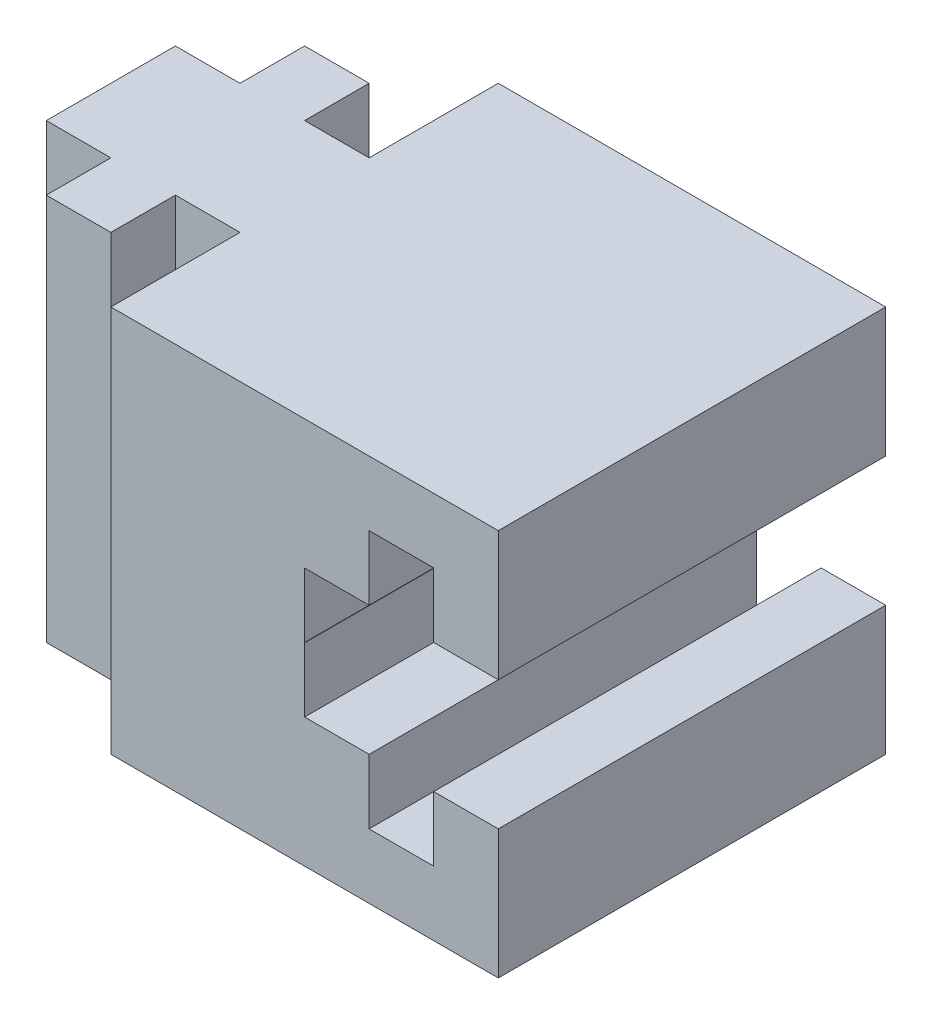
ISO-10303-21;
HEADER;
FILE_DESCRIPTION(('STEP AP214'),'2;1');
FILE_NAME('part.step','',(''),(''),'','','');
FILE_SCHEMA(('AUTOMOTIVE_DESIGN { 1 0 10303 214 1 1 1 1 }'));
ENDSEC;
DATA;
#1=APPLICATION_CONTEXT('core data for automotive mechanical design processes');
#2=APPLICATION_PROTOCOL_DEFINITION('international standard','automotive_design',2000,#1);
#3=PRODUCT_CONTEXT('',#1,'mechanical');
#4=PRODUCT('Part','Part','',(#3));
#5=PRODUCT_RELATED_PRODUCT_CATEGORY('part','',(#4));
#6=PRODUCT_DEFINITION_FORMATION('','',#4);
#7=PRODUCT_DEFINITION_CONTEXT('part definition',#1,'design');
#8=PRODUCT_DEFINITION('design','',#6,#7);
#9=PRODUCT_DEFINITION_SHAPE('','',#8);
#10=(LENGTH_UNIT() NAMED_UNIT(*) SI_UNIT(.MILLI.,.METRE.));
#11=(NAMED_UNIT(*) PLANE_ANGLE_UNIT() SI_UNIT($,.RADIAN.));
#12=(NAMED_UNIT(*) SI_UNIT($,.STERADIAN.) SOLID_ANGLE_UNIT());
#13=UNCERTAINTY_MEASURE_WITH_UNIT(LENGTH_MEASURE(1.E-05),#10,'distance_accuracy_value','');
#14=(GEOMETRIC_REPRESENTATION_CONTEXT(3) GLOBAL_UNCERTAINTY_ASSIGNED_CONTEXT((#13)) GLOBAL_UNIT_ASSIGNED_CONTEXT((#10,
#11,#12)) REPRESENTATION_CONTEXT('',''));
#15=CARTESIAN_POINT('',(0.,0.,0.));
#16=DIRECTION('',(0.,0.,1.));
#17=DIRECTION('',(1.,0.,0.));
#18=AXIS2_PLACEMENT_3D('',#15,#16,#17);
#19=CARTESIAN_POINT('',(225.,0.,0.));
#20=DIRECTION('',(1.,0.,0.));
#21=DIRECTION('',(0.,0.,-1.));
#22=AXIS2_PLACEMENT_3D('',#19,#20,#21);
#23=PLANE('',#22);
#24=DIRECTION('',(0.,0.,1.));
#25=VECTOR('',#24,1.);
#26=CARTESIAN_POINT('',(225.,-25.,-75.));
#27=LINE('',#26,#25);
#28=CARTESIAN_POINT('',(225.,-25.,-75.));
#29=VERTEX_POINT('',#28);
#30=CARTESIAN_POINT('',(225.,-25.,75.));
#31=VERTEX_POINT('',#30);
#32=EDGE_CURVE('E244',#29,#31,#27,.T.);
#33=ORIENTED_EDGE('',*,*,#32,.T.);
#34=DIRECTION('',(0.,-1.,0.));
#35=VECTOR('',#34,1.);
#36=CARTESIAN_POINT('',(225.,75.,75.));
#37=LINE('',#36,#35);
#38=CARTESIAN_POINT('',(225.,-75.,75.));
#39=VERTEX_POINT('',#38);
#40=EDGE_CURVE('E271',#31,#39,#37,.T.);
#41=ORIENTED_EDGE('',*,*,#40,.T.);
#42=DIRECTION('',(0.,0.,-1.));
#43=VECTOR('',#42,1.);
#44=CARTESIAN_POINT('',(225.,-75.,75.));
#45=LINE('',#44,#43);
#46=CARTESIAN_POINT('',(225.,-75.,-75.));
#47=VERTEX_POINT('',#46);
#48=EDGE_CURVE('E266',#39,#47,#45,.T.);
#49=ORIENTED_EDGE('',*,*,#48,.T.);
#50=DIRECTION('',(0.,1.,0.));
#51=VECTOR('',#50,1.);
#52=CARTESIAN_POINT('',(225.,75.,-75.));
#53=LINE('',#52,#51);
#54=EDGE_CURVE('E260',#47,#29,#53,.T.);
#55=ORIENTED_EDGE('',*,*,#54,.T.);
#56=EDGE_LOOP('',(#33,#41,#49,#55));
#57=FACE_BOUND('',#56,.T.);
#58=ADVANCED_FACE('F35',(#57),#23,.T.);
#59=CARTESIAN_POINT('',(225.,75.,-75.));
#60=DIRECTION('',(0.,0.,1.));
#61=DIRECTION('',(1.,0.,0.));
#62=AXIS2_PLACEMENT_3D('',#59,#60,#61);
#63=PLANE('',#62);
#64=DIRECTION('',(0.,1.,0.));
#65=VECTOR('',#64,1.);
#66=CARTESIAN_POINT('',(200.,-50.,-75.));
#67=LINE('',#66,#65);
#68=CARTESIAN_POINT('',(200.,-50.,-75.));
#69=VERTEX_POINT('',#68);
#70=CARTESIAN_POINT('',(200.,-25.,-75.));
#71=VERTEX_POINT('',#70);
#72=EDGE_CURVE('E255',#69,#71,#67,.T.);
#73=ORIENTED_EDGE('',*,*,#72,.T.);
#74=DIRECTION('',(1.,0.,0.));
#75=VECTOR('',#74,1.);
#76=CARTESIAN_POINT('',(200.,-25.,-75.));
#77=LINE('',#76,#75);
#78=EDGE_CURVE('E247',#71,#29,#77,.T.);
#79=ORIENTED_EDGE('',*,*,#78,.T.);
#80=ORIENTED_EDGE('',*,*,#54,.F.);
#81=DIRECTION('',(-1.,0.,0.));
#82=VECTOR('',#81,1.);
#83=CARTESIAN_POINT('',(225.,-75.,-75.));
#84=LINE('',#83,#82);
#85=CARTESIAN_POINT('',(75.,-75.,-75.));
#86=VERTEX_POINT('',#85);
#87=EDGE_CURVE('E282',#47,#86,#84,.T.);
#88=ORIENTED_EDGE('',*,*,#87,.T.);
#89=DIRECTION('',(0.,1.,0.));
#90=VECTOR('',#89,1.);
#91=CARTESIAN_POINT('',(75.,-75.,-75.));
#92=LINE('',#91,#90);
#93=CARTESIAN_POINT('',(75.,75.,-75.));
#94=VERTEX_POINT('',#93);
#95=EDGE_CURVE('E367',#86,#94,#92,.T.);
#96=ORIENTED_EDGE('',*,*,#95,.T.);
#97=DIRECTION('',(-1.,0.,0.));
#98=VECTOR('',#97,1.);
#99=CARTESIAN_POINT('',(225.,75.,-75.));
#100=LINE('',#99,#98);
#101=CARTESIAN_POINT('',(225.,75.,-75.));
#102=VERTEX_POINT('',#101);
#103=EDGE_CURVE('E11',#102,#94,#100,.T.);
#104=ORIENTED_EDGE('',*,*,#103,.F.);
#105=CARTESIAN_POINT('',(225.,25.,-75.));
#106=VERTEX_POINT('',#105);
#107=EDGE_CURVE('E269',#106,#102,#53,.T.);
#108=ORIENTED_EDGE('',*,*,#107,.F.);
#109=DIRECTION('',(-1.,0.,0.));
#110=VECTOR('',#109,1.);
#111=CARTESIAN_POINT('',(225.,25.,-75.));
#112=LINE('',#111,#110);
#113=CARTESIAN_POINT('',(200.,25.,-75.));
#114=VERTEX_POINT('',#113);
#115=EDGE_CURVE('E50',#106,#114,#112,.T.);
#116=ORIENTED_EDGE('',*,*,#115,.T.);
#117=DIRECTION('',(0.,1.,0.));
#118=VECTOR('',#117,1.);
#119=CARTESIAN_POINT('',(200.,25.,-75.));
#120=LINE('',#119,#118);
#121=CARTESIAN_POINT('',(200.,50.,-75.));
#122=VERTEX_POINT('',#121);
#123=EDGE_CURVE('E513',#114,#122,#120,.T.);
#124=ORIENTED_EDGE('',*,*,#123,.T.);
#125=DIRECTION('',(-1.,0.,0.));
#126=VECTOR('',#125,1.);
#127=CARTESIAN_POINT('',(200.,50.,-75.));
#128=LINE('',#127,#126);
#129=CARTESIAN_POINT('',(175.,50.,-75.));
#130=VERTEX_POINT('',#129);
#131=EDGE_CURVE('E510',#122,#130,#128,.T.);
#132=ORIENTED_EDGE('',*,*,#131,.T.);
#133=DIRECTION('',(0.,-1.,0.));
#134=VECTOR('',#133,1.);
#135=CARTESIAN_POINT('',(175.,50.,-75.));
#136=LINE('',#135,#134);
#137=CARTESIAN_POINT('',(175.,25.,-75.));
#138=VERTEX_POINT('',#137);
#139=EDGE_CURVE('E507',#130,#138,#136,.T.);
#140=ORIENTED_EDGE('',*,*,#139,.T.);
#141=DIRECTION('',(-1.,0.,0.));
#142=VECTOR('',#141,1.);
#143=CARTESIAN_POINT('',(175.,25.,-75.));
#144=LINE('',#143,#142);
#145=CARTESIAN_POINT('',(150.,25.,-75.));
#146=VERTEX_POINT('',#145);
#147=EDGE_CURVE('E504',#138,#146,#144,.T.);
#148=ORIENTED_EDGE('',*,*,#147,.T.);
#149=DIRECTION('',(0.,-1.,0.));
#150=VECTOR('',#149,1.);
#151=CARTESIAN_POINT('',(150.,25.,-75.));
#152=LINE('',#151,#150);
#153=CARTESIAN_POINT('',(150.,0.,-75.));
#154=VERTEX_POINT('',#153);
#155=EDGE_CURVE('E501',#146,#154,#152,.T.);
#156=ORIENTED_EDGE('',*,*,#155,.T.);
#157=DIRECTION('',(-1.,0.,0.));
#158=VECTOR('',#157,1.);
#159=CARTESIAN_POINT('',(150.,0.,-75.));
#160=LINE('',#159,#158);
#161=CARTESIAN_POINT('',(149.85679380495,0.,-75.));
#162=VERTEX_POINT('',#161);
#163=EDGE_CURVE('E498',#154,#162,#160,.T.);
#164=ORIENTED_EDGE('',*,*,#163,.T.);
#165=DIRECTION('',(0.,-1.,0.));
#166=VECTOR('',#165,1.);
#167=CARTESIAN_POINT('',(149.85679380495,0.,-75.));
#168=LINE('',#167,#166);
#169=CARTESIAN_POINT('',(149.85679380495,-0.127059700129785,-75.));
#170=VERTEX_POINT('',#169);
#171=EDGE_CURVE('E495',#162,#170,#168,.T.);
#172=ORIENTED_EDGE('',*,*,#171,.T.);
#173=DIRECTION('',(-1.,0.,0.));
#174=VECTOR('',#173,1.);
#175=CARTESIAN_POINT('',(150.,-0.127059700129785,-75.));
#176=LINE('',#175,#174);
#177=CARTESIAN_POINT('',(150.,-0.127059700129785,-75.));
#178=VERTEX_POINT('',#177);
#179=EDGE_CURVE('E493',#178,#170,#176,.T.);
#180=ORIENTED_EDGE('',*,*,#179,.F.);
#181=DIRECTION('',(0.,-1.,0.));
#182=VECTOR('',#181,1.);
#183=CARTESIAN_POINT('',(150.,-0.127059700129785,-75.));
#184=LINE('',#183,#182);
#185=CARTESIAN_POINT('',(150.,-25.,-75.));
#186=VERTEX_POINT('',#185);
#187=EDGE_CURVE('E490',#178,#186,#184,.T.);
#188=ORIENTED_EDGE('',*,*,#187,.T.);
#189=DIRECTION('',(1.,0.,0.));
#190=VECTOR('',#189,1.);
#191=CARTESIAN_POINT('',(150.,-25.,-75.));
#192=LINE('',#191,#190);
#193=CARTESIAN_POINT('',(175.,-25.,-75.));
#194=VERTEX_POINT('',#193);
#195=EDGE_CURVE('E487',#186,#194,#192,.T.);
#196=ORIENTED_EDGE('',*,*,#195,.T.);
#197=DIRECTION('',(0.,-1.,0.));
#198=VECTOR('',#197,1.);
#199=CARTESIAN_POINT('',(175.,-25.,-75.));
#200=LINE('',#199,#198);
#201=CARTESIAN_POINT('',(175.,-50.,-75.));
#202=VERTEX_POINT('',#201);
#203=EDGE_CURVE('E484',#194,#202,#200,.T.);
#204=ORIENTED_EDGE('',*,*,#203,.T.);
#205=DIRECTION('',(1.,0.,0.));
#206=VECTOR('',#205,1.);
#207=CARTESIAN_POINT('',(175.,-50.,-75.));
#208=LINE('',#207,#206);
#209=EDGE_CURVE('E482',#202,#69,#208,.T.);
#210=ORIENTED_EDGE('',*,*,#209,.T.);
#211=EDGE_LOOP('',(#73,#79,#80,#88,#96,#104,#108,#116,#124,#132,#140,#148,#156,#164,#172,#180,
#188,#196,#204,#210));
#212=FACE_BOUND('',#211,.T.);
#213=ADVANCED_FACE('F37',(#212),#63,.F.);
#214=CARTESIAN_POINT('',(225.,75.,75.));
#215=DIRECTION('',(0.,-1.,0.));
#216=DIRECTION('',(0.,0.,-1.));
#217=AXIS2_PLACEMENT_3D('',#214,#215,#216);
#218=PLANE('',#217);
#219=DIRECTION('',(0.,0.,-1.));
#220=VECTOR('',#219,1.);
#221=CARTESIAN_POINT('',(25.,75.,0.));
#222=LINE('',#221,#220);
#223=CARTESIAN_POINT('',(25.,75.,-25.));
#224=VERTEX_POINT('',#223);
#225=CARTESIAN_POINT('',(25.,75.,-50.));
#226=VERTEX_POINT('',#225);
#227=EDGE_CURVE('E387',#224,#226,#222,.T.);
#228=ORIENTED_EDGE('',*,*,#227,.F.);
#229=DIRECTION('',(1.,0.,0.));
#230=VECTOR('',#229,1.);
#231=CARTESIAN_POINT('',(0.,75.,-25.));
#232=LINE('',#231,#230);
#233=CARTESIAN_POINT('',(0.,75.,-25.));
#234=VERTEX_POINT('',#233);
#235=EDGE_CURVE('E390',#234,#224,#232,.T.);
#236=ORIENTED_EDGE('',*,*,#235,.F.);
#237=DIRECTION('',(0.,0.,1.));
#238=VECTOR('',#237,1.);
#239=CARTESIAN_POINT('',(0.,75.,75.));
#240=LINE('',#239,#238);
#241=CARTESIAN_POINT('',(0.,75.,25.));
#242=VERTEX_POINT('',#241);
#243=EDGE_CURVE('E283',#234,#242,#240,.T.);
#244=ORIENTED_EDGE('',*,*,#243,.T.);
#245=DIRECTION('',(-1.,0.,0.));
#246=VECTOR('',#245,1.);
#247=CARTESIAN_POINT('',(0.,75.,25.));
#248=LINE('',#247,#246);
#249=CARTESIAN_POINT('',(25.,75.,25.));
#250=VERTEX_POINT('',#249);
#251=EDGE_CURVE('E58',#250,#242,#248,.T.);
#252=ORIENTED_EDGE('',*,*,#251,.F.);
#253=DIRECTION('',(0.,0.,-1.));
#254=VECTOR('',#253,1.);
#255=CARTESIAN_POINT('',(25.,75.,0.));
#256=LINE('',#255,#254);
#257=CARTESIAN_POINT('',(25.,75.,50.));
#258=VERTEX_POINT('',#257);
#259=EDGE_CURVE('E328',#258,#250,#256,.T.);
#260=ORIENTED_EDGE('',*,*,#259,.F.);
#261=DIRECTION('',(1.,0.,0.));
#262=VECTOR('',#261,1.);
#263=CARTESIAN_POINT('',(0.,75.,50.));
#264=LINE('',#263,#262);
#265=CARTESIAN_POINT('',(50.,75.,50.));
#266=VERTEX_POINT('',#265);
#267=EDGE_CURVE('E325',#258,#266,#264,.T.);
#268=ORIENTED_EDGE('',*,*,#267,.T.);
#269=DIRECTION('',(0.,0.,1.));
#270=VECTOR('',#269,1.);
#271=CARTESIAN_POINT('',(50.,75.,0.));
#272=LINE('',#271,#270);
#273=CARTESIAN_POINT('',(50.,75.,25.));
#274=VERTEX_POINT('',#273);
#275=EDGE_CURVE('E315',#274,#266,#272,.T.);
#276=ORIENTED_EDGE('',*,*,#275,.F.);
#277=DIRECTION('',(-1.,0.,0.));
#278=VECTOR('',#277,1.);
#279=CARTESIAN_POINT('',(0.,75.,25.));
#280=LINE('',#279,#278);
#281=CARTESIAN_POINT('',(75.,75.,25.));
#282=VERTEX_POINT('',#281);
#283=EDGE_CURVE('E311',#282,#274,#280,.T.);
#284=ORIENTED_EDGE('',*,*,#283,.F.);
#285=DIRECTION('',(0.,0.,-1.));
#286=VECTOR('',#285,1.);
#287=CARTESIAN_POINT('',(75.,75.,0.));
#288=LINE('',#287,#286);
#289=CARTESIAN_POINT('',(75.,75.,75.));
#290=VERTEX_POINT('',#289);
#291=EDGE_CURVE('E308',#290,#282,#288,.T.);
#292=ORIENTED_EDGE('',*,*,#291,.F.);
#293=DIRECTION('',(-1.,0.,0.));
#294=VECTOR('',#293,1.);
#295=CARTESIAN_POINT('',(225.,75.,75.));
#296=LINE('',#295,#294);
#297=CARTESIAN_POINT('',(225.,75.,75.));
#298=VERTEX_POINT('',#297);
#299=EDGE_CURVE('E43',#298,#290,#296,.T.);
#300=ORIENTED_EDGE('',*,*,#299,.F.);
#301=DIRECTION('',(0.,0.,1.));
#302=VECTOR('',#301,1.);
#303=CARTESIAN_POINT('',(225.,75.,75.));
#304=LINE('',#303,#302);
#305=EDGE_CURVE('E268',#102,#298,#304,.T.);
#306=ORIENTED_EDGE('',*,*,#305,.F.);
#307=ORIENTED_EDGE('',*,*,#103,.T.);
#308=DIRECTION('',(0.,0.,-1.));
#309=VECTOR('',#308,1.);
#310=CARTESIAN_POINT('',(75.,75.,0.));
#311=LINE('',#310,#309);
#312=CARTESIAN_POINT('',(75.,75.,-25.));
#313=VERTEX_POINT('',#312);
#314=EDGE_CURVE('E393',#313,#94,#311,.T.);
#315=ORIENTED_EDGE('',*,*,#314,.F.);
#316=DIRECTION('',(1.,0.,0.));
#317=VECTOR('',#316,1.);
#318=CARTESIAN_POINT('',(0.,75.,-25.));
#319=LINE('',#318,#317);
#320=CARTESIAN_POINT('',(50.,75.,-25.));
#321=VERTEX_POINT('',#320);
#322=EDGE_CURVE('E335',#321,#313,#319,.T.);
#323=ORIENTED_EDGE('',*,*,#322,.F.);
#324=DIRECTION('',(0.,0.,1.));
#325=VECTOR('',#324,1.);
#326=CARTESIAN_POINT('',(50.,75.,0.));
#327=LINE('',#326,#325);
#328=CARTESIAN_POINT('',(50.,75.,-50.));
#329=VERTEX_POINT('',#328);
#330=EDGE_CURVE('E380',#329,#321,#327,.T.);
#331=ORIENTED_EDGE('',*,*,#330,.F.);
#332=DIRECTION('',(1.,0.,0.));
#333=VECTOR('',#332,1.);
#334=CARTESIAN_POINT('',(0.,75.,-50.));
#335=LINE('',#334,#333);
#336=EDGE_CURVE('E384',#226,#329,#335,.T.);
#337=ORIENTED_EDGE('',*,*,#336,.F.);
#338=EDGE_LOOP('',(#228,#236,#244,#252,#260,#268,#276,#284,#292,#300,#306,#307,#315,#323,#331,#337));
#339=FACE_BOUND('',#338,.T.);
#340=ADVANCED_FACE('F304',(#339),#218,.F.);
#341=CARTESIAN_POINT('',(225.,75.,75.));
#342=DIRECTION('',(0.,0.,-1.));
#343=DIRECTION('',(0.,1.,0.));
#344=AXIS2_PLACEMENT_3D('',#341,#342,#343);
#345=PLANE('',#344);
#346=ORIENTED_EDGE('',*,*,#40,.F.);
#347=DIRECTION('',(1.,0.,0.));
#348=VECTOR('',#347,1.);
#349=CARTESIAN_POINT('',(200.,-25.,75.));
#350=LINE('',#349,#348);
#351=CARTESIAN_POINT('',(200.,-25.,75.));
#352=VERTEX_POINT('',#351);
#353=EDGE_CURVE('E250',#352,#31,#350,.T.);
#354=ORIENTED_EDGE('',*,*,#353,.F.);
#355=DIRECTION('',(0.,1.,0.));
#356=VECTOR('',#355,1.);
#357=CARTESIAN_POINT('',(200.,-50.,75.));
#358=LINE('',#357,#356);
#359=CARTESIAN_POINT('',(200.,-50.,75.));
#360=VERTEX_POINT('',#359);
#361=EDGE_CURVE('E263',#360,#352,#358,.T.);
#362=ORIENTED_EDGE('',*,*,#361,.F.);
#363=DIRECTION('',(1.,0.,0.));
#364=VECTOR('',#363,1.);
#365=CARTESIAN_POINT('',(175.,-50.,75.));
#366=LINE('',#365,#364);
#367=CARTESIAN_POINT('',(175.,-50.,75.));
#368=VERTEX_POINT('',#367);
#369=EDGE_CURVE('E441',#368,#360,#366,.T.);
#370=ORIENTED_EDGE('',*,*,#369,.F.);
#371=DIRECTION('',(0.,-1.,0.));
#372=VECTOR('',#371,1.);
#373=CARTESIAN_POINT('',(175.,-25.,75.));
#374=LINE('',#373,#372);
#375=CARTESIAN_POINT('',(175.,-25.,75.));
#376=VERTEX_POINT('',#375);
#377=EDGE_CURVE('E444',#376,#368,#374,.T.);
#378=ORIENTED_EDGE('',*,*,#377,.F.);
#379=DIRECTION('',(1.,0.,0.));
#380=VECTOR('',#379,1.);
#381=CARTESIAN_POINT('',(150.,-25.,75.));
#382=LINE('',#381,#380);
#383=CARTESIAN_POINT('',(150.,-25.,75.));
#384=VERTEX_POINT('',#383);
#385=EDGE_CURVE('E447',#384,#376,#382,.T.);
#386=ORIENTED_EDGE('',*,*,#385,.F.);
#387=DIRECTION('',(0.,-1.,0.));
#388=VECTOR('',#387,1.);
#389=CARTESIAN_POINT('',(150.,-0.127059700129785,75.));
#390=LINE('',#389,#388);
#391=CARTESIAN_POINT('',(150.,-0.127059700129785,75.));
#392=VERTEX_POINT('',#391);
#393=EDGE_CURVE('E450',#392,#384,#390,.T.);
#394=ORIENTED_EDGE('',*,*,#393,.F.);
#395=DIRECTION('',(-1.,0.,0.));
#396=VECTOR('',#395,1.);
#397=CARTESIAN_POINT('',(150.,-0.127059700129785,75.));
#398=LINE('',#397,#396);
#399=CARTESIAN_POINT('',(149.85679380495,-0.127059700129785,75.));
#400=VERTEX_POINT('',#399);
#401=EDGE_CURVE('E453',#392,#400,#398,.T.);
#402=ORIENTED_EDGE('',*,*,#401,.T.);
#403=DIRECTION('',(0.,-1.,0.));
#404=VECTOR('',#403,1.);
#405=CARTESIAN_POINT('',(149.85679380495,0.,75.));
#406=LINE('',#405,#404);
#407=CARTESIAN_POINT('',(149.85679380495,0.,75.));
#408=VERTEX_POINT('',#407);
#409=EDGE_CURVE('E456',#408,#400,#406,.T.);
#410=ORIENTED_EDGE('',*,*,#409,.F.);
#411=DIRECTION('',(-1.,0.,0.));
#412=VECTOR('',#411,1.);
#413=CARTESIAN_POINT('',(150.,0.,75.));
#414=LINE('',#413,#412);
#415=CARTESIAN_POINT('',(150.,0.,75.));
#416=VERTEX_POINT('',#415);
#417=EDGE_CURVE('E459',#416,#408,#414,.T.);
#418=ORIENTED_EDGE('',*,*,#417,.F.);
#419=DIRECTION('',(0.,-1.,0.));
#420=VECTOR('',#419,1.);
#421=CARTESIAN_POINT('',(150.,25.,75.));
#422=LINE('',#421,#420);
#423=CARTESIAN_POINT('',(150.,25.,75.));
#424=VERTEX_POINT('',#423);
#425=EDGE_CURVE('E462',#424,#416,#422,.T.);
#426=ORIENTED_EDGE('',*,*,#425,.F.);
#427=DIRECTION('',(-1.,0.,0.));
#428=VECTOR('',#427,1.);
#429=CARTESIAN_POINT('',(175.,25.,75.));
#430=LINE('',#429,#428);
#431=CARTESIAN_POINT('',(175.,25.,75.));
#432=VERTEX_POINT('',#431);
#433=EDGE_CURVE('E465',#432,#424,#430,.T.);
#434=ORIENTED_EDGE('',*,*,#433,.F.);
#435=DIRECTION('',(0.,-1.,0.));
#436=VECTOR('',#435,1.);
#437=CARTESIAN_POINT('',(175.,50.,75.));
#438=LINE('',#437,#436);
#439=CARTESIAN_POINT('',(175.,50.,75.));
#440=VERTEX_POINT('',#439);
#441=EDGE_CURVE('E468',#440,#432,#438,.T.);
#442=ORIENTED_EDGE('',*,*,#441,.F.);
#443=DIRECTION('',(-1.,0.,0.));
#444=VECTOR('',#443,1.);
#445=CARTESIAN_POINT('',(200.,50.,75.));
#446=LINE('',#445,#444);
#447=CARTESIAN_POINT('',(200.,50.,75.));
#448=VERTEX_POINT('',#447);
#449=EDGE_CURVE('E471',#448,#440,#446,.T.);
#450=ORIENTED_EDGE('',*,*,#449,.F.);
#451=DIRECTION('',(0.,1.,0.));
#452=VECTOR('',#451,1.);
#453=CARTESIAN_POINT('',(200.,25.,75.));
#454=LINE('',#453,#452);
#455=CARTESIAN_POINT('',(200.,25.,75.));
#456=VERTEX_POINT('',#455);
#457=EDGE_CURVE('E474',#456,#448,#454,.T.);
#458=ORIENTED_EDGE('',*,*,#457,.F.);
#459=DIRECTION('',(-1.,0.,0.));
#460=VECTOR('',#459,1.);
#461=CARTESIAN_POINT('',(225.,25.,75.));
#462=LINE('',#461,#460);
#463=CARTESIAN_POINT('',(225.,25.,75.));
#464=VERTEX_POINT('',#463);
#465=EDGE_CURVE('E477',#464,#456,#462,.T.);
#466=ORIENTED_EDGE('',*,*,#465,.F.);
#467=EDGE_CURVE('E278',#298,#464,#37,.T.);
#468=ORIENTED_EDGE('',*,*,#467,.F.);
#469=ORIENTED_EDGE('',*,*,#299,.T.);
#470=DIRECTION('',(0.,1.,0.));
#471=VECTOR('',#470,1.);
#472=CARTESIAN_POINT('',(75.,-75.,75.));
#473=LINE('',#472,#471);
#474=CARTESIAN_POINT('',(75.,-75.,75.));
#475=VERTEX_POINT('',#474);
#476=EDGE_CURVE('E275',#475,#290,#473,.T.);
#477=ORIENTED_EDGE('',*,*,#476,.F.);
#478=DIRECTION('',(-1.,0.,0.));
#479=VECTOR('',#478,1.);
#480=CARTESIAN_POINT('',(225.,-75.,75.));
#481=LINE('',#480,#479);
#482=EDGE_CURVE('E290',#39,#475,#481,.T.);
#483=ORIENTED_EDGE('',*,*,#482,.F.);
#484=EDGE_LOOP('',(#346,#354,#362,#370,#378,#386,#394,#402,#410,#418,#426,#434,#442,#450,#458,
#466,#468,#469,#477,#483));
#485=FACE_BOUND('',#484,.T.);
#486=ADVANCED_FACE('F297',(#485),#345,.F.);
#487=CARTESIAN_POINT('',(225.,-75.,75.));
#488=DIRECTION('',(0.,1.,0.));
#489=DIRECTION('',(0.,0.,1.));
#490=AXIS2_PLACEMENT_3D('',#487,#488,#489);
#491=PLANE('',#490);
#492=DIRECTION('',(0.,0.,-1.));
#493=VECTOR('',#492,1.);
#494=CARTESIAN_POINT('',(0.,-75.,75.));
#495=LINE('',#494,#493);
#496=CARTESIAN_POINT('',(0.,-75.,25.));
#497=VERTEX_POINT('',#496);
#498=CARTESIAN_POINT('',(0.,-75.,-25.));
#499=VERTEX_POINT('',#498);
#500=EDGE_CURVE('E273',#497,#499,#495,.T.);
#501=ORIENTED_EDGE('',*,*,#500,.T.);
#502=DIRECTION('',(1.,0.,0.));
#503=VECTOR('',#502,1.);
#504=CARTESIAN_POINT('',(0.,-75.,-25.));
#505=LINE('',#504,#503);
#506=CARTESIAN_POINT('',(25.,-75.,-25.));
#507=VERTEX_POINT('',#506);
#508=EDGE_CURVE('E405',#499,#507,#505,.T.);
#509=ORIENTED_EDGE('',*,*,#508,.T.);
#510=DIRECTION('',(0.,0.,-1.));
#511=VECTOR('',#510,1.);
#512=CARTESIAN_POINT('',(25.,-75.,0.));
#513=LINE('',#512,#511);
#514=CARTESIAN_POINT('',(25.,-75.,-50.));
#515=VERTEX_POINT('',#514);
#516=EDGE_CURVE('E402',#507,#515,#513,.T.);
#517=ORIENTED_EDGE('',*,*,#516,.T.);
#518=DIRECTION('',(1.,0.,0.));
#519=VECTOR('',#518,1.);
#520=CARTESIAN_POINT('',(0.,-75.,-50.));
#521=LINE('',#520,#519);
#522=CARTESIAN_POINT('',(50.,-75.,-50.));
#523=VERTEX_POINT('',#522);
#524=EDGE_CURVE('E399',#515,#523,#521,.T.);
#525=ORIENTED_EDGE('',*,*,#524,.T.);
#526=DIRECTION('',(0.,0.,1.));
#527=VECTOR('',#526,1.);
#528=CARTESIAN_POINT('',(50.,-75.,0.));
#529=LINE('',#528,#527);
#530=CARTESIAN_POINT('',(50.,-75.,-25.));
#531=VERTEX_POINT('',#530);
#532=EDGE_CURVE('E368',#523,#531,#529,.T.);
#533=ORIENTED_EDGE('',*,*,#532,.T.);
#534=DIRECTION('',(1.,0.,0.));
#535=VECTOR('',#534,1.);
#536=CARTESIAN_POINT('',(0.,-75.,-25.));
#537=LINE('',#536,#535);
#538=CARTESIAN_POINT('',(75.,-75.,-25.));
#539=VERTEX_POINT('',#538);
#540=EDGE_CURVE('E383',#531,#539,#537,.T.);
#541=ORIENTED_EDGE('',*,*,#540,.T.);
#542=DIRECTION('',(0.,0.,-1.));
#543=VECTOR('',#542,1.);
#544=CARTESIAN_POINT('',(75.,-75.,0.));
#545=LINE('',#544,#543);
#546=EDGE_CURVE('E408',#539,#86,#545,.T.);
#547=ORIENTED_EDGE('',*,*,#546,.T.);
#548=ORIENTED_EDGE('',*,*,#87,.F.);
#549=ORIENTED_EDGE('',*,*,#48,.F.);
#550=ORIENTED_EDGE('',*,*,#482,.T.);
#551=DIRECTION('',(0.,0.,-1.));
#552=VECTOR('',#551,1.);
#553=CARTESIAN_POINT('',(75.,-75.,0.));
#554=LINE('',#553,#552);
#555=CARTESIAN_POINT('',(75.,-75.,25.));
#556=VERTEX_POINT('',#555);
#557=EDGE_CURVE('E332',#475,#556,#554,.T.);
#558=ORIENTED_EDGE('',*,*,#557,.T.);
#559=DIRECTION('',(-1.,0.,0.));
#560=VECTOR('',#559,1.);
#561=CARTESIAN_POINT('',(0.,-75.,25.));
#562=LINE('',#561,#560);
#563=CARTESIAN_POINT('',(50.,-75.,25.));
#564=VERTEX_POINT('',#563);
#565=EDGE_CURVE('E360',#556,#564,#562,.T.);
#566=ORIENTED_EDGE('',*,*,#565,.T.);
#567=DIRECTION('',(0.,0.,1.));
#568=VECTOR('',#567,1.);
#569=CARTESIAN_POINT('',(50.,-75.,0.));
#570=LINE('',#569,#568);
#571=CARTESIAN_POINT('',(50.,-75.,50.));
#572=VERTEX_POINT('',#571);
#573=EDGE_CURVE('E355',#564,#572,#570,.T.);
#574=ORIENTED_EDGE('',*,*,#573,.T.);
#575=DIRECTION('',(1.,0.,0.));
#576=VECTOR('',#575,1.);
#577=CARTESIAN_POINT('',(0.,-75.,50.));
#578=LINE('',#577,#576);
#579=CARTESIAN_POINT('',(25.,-75.,50.));
#580=VERTEX_POINT('',#579);
#581=EDGE_CURVE('E352',#580,#572,#578,.T.);
#582=ORIENTED_EDGE('',*,*,#581,.F.);
#583=DIRECTION('',(0.,0.,-1.));
#584=VECTOR('',#583,1.);
#585=CARTESIAN_POINT('',(25.,-75.,0.));
#586=LINE('',#585,#584);
#587=CARTESIAN_POINT('',(25.,-75.,25.));
#588=VERTEX_POINT('',#587);
#589=EDGE_CURVE('E347',#580,#588,#586,.T.);
#590=ORIENTED_EDGE('',*,*,#589,.T.);
#591=DIRECTION('',(-1.,0.,0.));
#592=VECTOR('',#591,1.);
#593=CARTESIAN_POINT('',(0.,-75.,25.));
#594=LINE('',#593,#592);
#595=EDGE_CURVE('E320',#588,#497,#594,.T.);
#596=ORIENTED_EDGE('',*,*,#595,.T.);
#597=EDGE_LOOP('',(#501,#509,#517,#525,#533,#541,#547,#548,#549,#550,#558,#566,#574,#582,#590,#596));
#598=FACE_BOUND('',#597,.T.);
#599=ADVANCED_FACE('F572',(#598),#491,.F.);
#600=DIRECTION('',(0.,0.,1.));
#601=VECTOR('',#600,1.);
#602=CARTESIAN_POINT('',(225.,25.,-75.));
#603=LINE('',#602,#601);
#604=EDGE_CURVE('E254',#106,#464,#603,.T.);
#605=ORIENTED_EDGE('',*,*,#604,.F.);
#606=ORIENTED_EDGE('',*,*,#107,.T.);
#607=ORIENTED_EDGE('',*,*,#305,.T.);
#608=ORIENTED_EDGE('',*,*,#467,.T.);
#609=EDGE_LOOP('',(#605,#606,#607,#608));
#610=FACE_BOUND('',#609,.T.);
#611=ADVANCED_FACE('F519',(#610),#23,.T.);
#612=CARTESIAN_POINT('',(0.,0.,0.));
#613=DIRECTION('',(1.,0.,0.));
#614=DIRECTION('',(0.,0.,-1.));
#615=AXIS2_PLACEMENT_3D('',#612,#613,#614);
#616=PLANE('',#615);
#617=ORIENTED_EDGE('',*,*,#243,.F.);
#618=DIRECTION('',(0.,1.,0.));
#619=VECTOR('',#618,1.);
#620=CARTESIAN_POINT('',(0.,-75.,-25.));
#621=LINE('',#620,#619);
#622=EDGE_CURVE('E371',#499,#234,#621,.T.);
#623=ORIENTED_EDGE('',*,*,#622,.F.);
#624=ORIENTED_EDGE('',*,*,#500,.F.);
#625=DIRECTION('',(0.,1.,0.));
#626=VECTOR('',#625,1.);
#627=CARTESIAN_POINT('',(0.,-75.,25.));
#628=LINE('',#627,#626);
#629=EDGE_CURVE('E333',#497,#242,#628,.T.);
#630=ORIENTED_EDGE('',*,*,#629,.T.);
#631=EDGE_LOOP('',(#617,#623,#624,#630));
#632=FACE_BOUND('',#631,.T.);
#633=ADVANCED_FACE('F598',(#632),#616,.F.);
#634=CARTESIAN_POINT('',(0.,-75.,25.));
#635=DIRECTION('',(0.,0.,-1.));
#636=DIRECTION('',(-1.,0.,0.));
#637=AXIS2_PLACEMENT_3D('',#634,#635,#636);
#638=PLANE('',#637);
#639=ORIENTED_EDGE('',*,*,#251,.T.);
#640=ORIENTED_EDGE('',*,*,#629,.F.);
#641=ORIENTED_EDGE('',*,*,#595,.F.);
#642=DIRECTION('',(0.,1.,0.));
#643=VECTOR('',#642,1.);
#644=CARTESIAN_POINT('',(25.,-75.,25.));
#645=LINE('',#644,#643);
#646=EDGE_CURVE('E336',#588,#250,#645,.T.);
#647=ORIENTED_EDGE('',*,*,#646,.T.);
#648=EDGE_LOOP('',(#639,#640,#641,#647));
#649=FACE_BOUND('',#648,.T.);
#650=ADVANCED_FACE('F599',(#649),#638,.F.);
#651=CARTESIAN_POINT('',(25.,-75.,0.));
#652=DIRECTION('',(1.,0.,0.));
#653=DIRECTION('',(0.,0.,-1.));
#654=AXIS2_PLACEMENT_3D('',#651,#652,#653);
#655=PLANE('',#654);
#656=ORIENTED_EDGE('',*,*,#259,.T.);
#657=ORIENTED_EDGE('',*,*,#646,.F.);
#658=ORIENTED_EDGE('',*,*,#589,.F.);
#659=DIRECTION('',(0.,1.,0.));
#660=VECTOR('',#659,1.);
#661=CARTESIAN_POINT('',(25.,-75.,50.));
#662=LINE('',#661,#660);
#663=EDGE_CURVE('E338',#580,#258,#662,.T.);
#664=ORIENTED_EDGE('',*,*,#663,.T.);
#665=EDGE_LOOP('',(#656,#657,#658,#664));
#666=FACE_BOUND('',#665,.T.);
#667=ADVANCED_FACE('F602',(#666),#655,.F.);
#668=CARTESIAN_POINT('',(0.,-75.,50.));
#669=DIRECTION('',(0.,0.,1.));
#670=DIRECTION('',(1.,0.,0.));
#671=AXIS2_PLACEMENT_3D('',#668,#669,#670);
#672=PLANE('',#671);
#673=ORIENTED_EDGE('',*,*,#267,.F.);
#674=ORIENTED_EDGE('',*,*,#663,.F.);
#675=ORIENTED_EDGE('',*,*,#581,.T.);
#676=DIRECTION('',(0.,1.,0.));
#677=VECTOR('',#676,1.);
#678=CARTESIAN_POINT('',(50.,-75.,50.));
#679=LINE('',#678,#677);
#680=EDGE_CURVE('E340',#572,#266,#679,.T.);
#681=ORIENTED_EDGE('',*,*,#680,.T.);
#682=EDGE_LOOP('',(#673,#674,#675,#681));
#683=FACE_BOUND('',#682,.T.);
#684=ADVANCED_FACE('F605',(#683),#672,.T.);
#685=CARTESIAN_POINT('',(50.,-75.,0.));
#686=DIRECTION('',(-1.,0.,0.));
#687=DIRECTION('',(0.,0.,1.));
#688=AXIS2_PLACEMENT_3D('',#685,#686,#687);
#689=PLANE('',#688);
#690=ORIENTED_EDGE('',*,*,#275,.T.);
#691=ORIENTED_EDGE('',*,*,#680,.F.);
#692=ORIENTED_EDGE('',*,*,#573,.F.);
#693=DIRECTION('',(0.,1.,0.));
#694=VECTOR('',#693,1.);
#695=CARTESIAN_POINT('',(50.,-75.,25.));
#696=LINE('',#695,#694);
#697=EDGE_CURVE('E342',#564,#274,#696,.T.);
#698=ORIENTED_EDGE('',*,*,#697,.T.);
#699=EDGE_LOOP('',(#690,#691,#692,#698));
#700=FACE_BOUND('',#699,.T.);
#701=ADVANCED_FACE('F609',(#700),#689,.F.);
#702=CARTESIAN_POINT('',(0.,-75.,25.));
#703=DIRECTION('',(0.,0.,-1.));
#704=DIRECTION('',(-1.,0.,0.));
#705=AXIS2_PLACEMENT_3D('',#702,#703,#704);
#706=PLANE('',#705);
#707=ORIENTED_EDGE('',*,*,#283,.T.);
#708=ORIENTED_EDGE('',*,*,#697,.F.);
#709=ORIENTED_EDGE('',*,*,#565,.F.);
#710=DIRECTION('',(0.,1.,0.));
#711=VECTOR('',#710,1.);
#712=CARTESIAN_POINT('',(75.,-75.,25.));
#713=LINE('',#712,#711);
#714=EDGE_CURVE('E343',#556,#282,#713,.T.);
#715=ORIENTED_EDGE('',*,*,#714,.T.);
#716=EDGE_LOOP('',(#707,#708,#709,#715));
#717=FACE_BOUND('',#716,.T.);
#718=ADVANCED_FACE('F610',(#717),#706,.F.);
#719=CARTESIAN_POINT('',(75.,-75.,0.));
#720=DIRECTION('',(1.,0.,0.));
#721=DIRECTION('',(0.,0.,-1.));
#722=AXIS2_PLACEMENT_3D('',#719,#720,#721);
#723=PLANE('',#722);
#724=ORIENTED_EDGE('',*,*,#291,.T.);
#725=ORIENTED_EDGE('',*,*,#714,.F.);
#726=ORIENTED_EDGE('',*,*,#557,.F.);
#727=ORIENTED_EDGE('',*,*,#476,.T.);
#728=EDGE_LOOP('',(#724,#725,#726,#727));
#729=FACE_BOUND('',#728,.T.);
#730=ADVANCED_FACE('F612',(#729),#723,.F.);
#731=CARTESIAN_POINT('',(0.,-75.,-25.));
#732=DIRECTION('',(0.,0.,1.));
#733=DIRECTION('',(1.,0.,0.));
#734=AXIS2_PLACEMENT_3D('',#731,#732,#733);
#735=PLANE('',#734);
#736=ORIENTED_EDGE('',*,*,#322,.T.);
#737=DIRECTION('',(0.,1.,0.));
#738=VECTOR('',#737,1.);
#739=CARTESIAN_POINT('',(75.,-75.,-25.));
#740=LINE('',#739,#738);
#741=EDGE_CURVE('E365',#539,#313,#740,.T.);
#742=ORIENTED_EDGE('',*,*,#741,.F.);
#743=ORIENTED_EDGE('',*,*,#540,.F.);
#744=DIRECTION('',(0.,1.,0.));
#745=VECTOR('',#744,1.);
#746=CARTESIAN_POINT('',(50.,-75.,-25.));
#747=LINE('',#746,#745);
#748=EDGE_CURVE('E286',#531,#321,#747,.T.);
#749=ORIENTED_EDGE('',*,*,#748,.T.);
#750=EDGE_LOOP('',(#736,#742,#743,#749));
#751=FACE_BOUND('',#750,.T.);
#752=ADVANCED_FACE('F581',(#751),#735,.F.);
#753=CARTESIAN_POINT('',(50.,-75.,0.));
#754=DIRECTION('',(-1.,0.,0.));
#755=DIRECTION('',(0.,0.,1.));
#756=AXIS2_PLACEMENT_3D('',#753,#754,#755);
#757=PLANE('',#756);
#758=ORIENTED_EDGE('',*,*,#330,.T.);
#759=ORIENTED_EDGE('',*,*,#748,.F.);
#760=ORIENTED_EDGE('',*,*,#532,.F.);
#761=DIRECTION('',(0.,1.,0.));
#762=VECTOR('',#761,1.);
#763=CARTESIAN_POINT('',(50.,-75.,-50.));
#764=LINE('',#763,#762);
#765=EDGE_CURVE('E377',#523,#329,#764,.T.);
#766=ORIENTED_EDGE('',*,*,#765,.T.);
#767=EDGE_LOOP('',(#758,#759,#760,#766));
#768=FACE_BOUND('',#767,.T.);
#769=ADVANCED_FACE('F584',(#768),#757,.F.);
#770=CARTESIAN_POINT('',(0.,-75.,-50.));
#771=DIRECTION('',(0.,0.,1.));
#772=DIRECTION('',(1.,0.,0.));
#773=AXIS2_PLACEMENT_3D('',#770,#771,#772);
#774=PLANE('',#773);
#775=ORIENTED_EDGE('',*,*,#336,.T.);
#776=ORIENTED_EDGE('',*,*,#765,.F.);
#777=ORIENTED_EDGE('',*,*,#524,.F.);
#778=DIRECTION('',(0.,1.,0.));
#779=VECTOR('',#778,1.);
#780=CARTESIAN_POINT('',(25.,-75.,-50.));
#781=LINE('',#780,#779);
#782=EDGE_CURVE('E375',#515,#226,#781,.T.);
#783=ORIENTED_EDGE('',*,*,#782,.T.);
#784=EDGE_LOOP('',(#775,#776,#777,#783));
#785=FACE_BOUND('',#784,.T.);
#786=ADVANCED_FACE('F588',(#785),#774,.F.);
#787=CARTESIAN_POINT('',(25.,-75.,0.));
#788=DIRECTION('',(1.,0.,0.));
#789=DIRECTION('',(0.,0.,-1.));
#790=AXIS2_PLACEMENT_3D('',#787,#788,#789);
#791=PLANE('',#790);
#792=ORIENTED_EDGE('',*,*,#227,.T.);
#793=ORIENTED_EDGE('',*,*,#782,.F.);
#794=ORIENTED_EDGE('',*,*,#516,.F.);
#795=DIRECTION('',(0.,1.,0.));
#796=VECTOR('',#795,1.);
#797=CARTESIAN_POINT('',(25.,-75.,-25.));
#798=LINE('',#797,#796);
#799=EDGE_CURVE('E373',#507,#224,#798,.T.);
#800=ORIENTED_EDGE('',*,*,#799,.T.);
#801=EDGE_LOOP('',(#792,#793,#794,#800));
#802=FACE_BOUND('',#801,.T.);
#803=ADVANCED_FACE('F592',(#802),#791,.F.);
#804=CARTESIAN_POINT('',(0.,-75.,-25.));
#805=DIRECTION('',(0.,0.,1.));
#806=DIRECTION('',(1.,0.,0.));
#807=AXIS2_PLACEMENT_3D('',#804,#805,#806);
#808=PLANE('',#807);
#809=ORIENTED_EDGE('',*,*,#235,.T.);
#810=ORIENTED_EDGE('',*,*,#799,.F.);
#811=ORIENTED_EDGE('',*,*,#508,.F.);
#812=ORIENTED_EDGE('',*,*,#622,.T.);
#813=EDGE_LOOP('',(#809,#810,#811,#812));
#814=FACE_BOUND('',#813,.T.);
#815=ADVANCED_FACE('F594',(#814),#808,.F.);
#816=CARTESIAN_POINT('',(75.,-75.,0.));
#817=DIRECTION('',(1.,0.,0.));
#818=DIRECTION('',(0.,0.,-1.));
#819=AXIS2_PLACEMENT_3D('',#816,#817,#818);
#820=PLANE('',#819);
#821=ORIENTED_EDGE('',*,*,#314,.T.);
#822=ORIENTED_EDGE('',*,*,#95,.F.);
#823=ORIENTED_EDGE('',*,*,#546,.F.);
#824=ORIENTED_EDGE('',*,*,#741,.T.);
#825=EDGE_LOOP('',(#821,#822,#823,#824));
#826=FACE_BOUND('',#825,.T.);
#827=ADVANCED_FACE('F578',(#826),#820,.F.);
#828=CARTESIAN_POINT('',(200.,-25.,-75.));
#829=DIRECTION('',(0.,-1.,0.));
#830=DIRECTION('',(1.,0.,0.));
#831=AXIS2_PLACEMENT_3D('',#828,#829,#830);
#832=PLANE('',#831);
#833=ORIENTED_EDGE('',*,*,#353,.T.);
#834=ORIENTED_EDGE('',*,*,#32,.F.);
#835=ORIENTED_EDGE('',*,*,#78,.F.);
#836=DIRECTION('',(0.,0.,1.));
#837=VECTOR('',#836,1.);
#838=CARTESIAN_POINT('',(200.,-25.,-75.));
#839=LINE('',#838,#837);
#840=EDGE_CURVE('E313',#71,#352,#839,.T.);
#841=ORIENTED_EDGE('',*,*,#840,.T.);
#842=EDGE_LOOP('',(#833,#834,#835,#841));
#843=FACE_BOUND('',#842,.T.);
#844=ADVANCED_FACE('F246',(#843),#832,.F.);
#845=CARTESIAN_POINT('',(200.,-50.,-75.));
#846=DIRECTION('',(1.,0.,0.));
#847=DIRECTION('',(0.,0.,-1.));
#848=AXIS2_PLACEMENT_3D('',#845,#846,#847);
#849=PLANE('',#848);
#850=ORIENTED_EDGE('',*,*,#361,.T.);
#851=ORIENTED_EDGE('',*,*,#840,.F.);
#852=ORIENTED_EDGE('',*,*,#72,.F.);
#853=DIRECTION('',(0.,0.,1.));
#854=VECTOR('',#853,1.);
#855=CARTESIAN_POINT('',(200.,-50.,-75.));
#856=LINE('',#855,#854);
#857=EDGE_CURVE('E317',#69,#360,#856,.T.);
#858=ORIENTED_EDGE('',*,*,#857,.T.);
#859=EDGE_LOOP('',(#850,#851,#852,#858));
#860=FACE_BOUND('',#859,.T.);
#861=ADVANCED_FACE('F571',(#860),#849,.F.);
#862=CARTESIAN_POINT('',(175.,-50.,-75.));
#863=DIRECTION('',(0.,-1.,0.));
#864=DIRECTION('',(0.,0.,-1.));
#865=AXIS2_PLACEMENT_3D('',#862,#863,#864);
#866=PLANE('',#865);
#867=ORIENTED_EDGE('',*,*,#369,.T.);
#868=ORIENTED_EDGE('',*,*,#857,.F.);
#869=ORIENTED_EDGE('',*,*,#209,.F.);
#870=DIRECTION('',(0.,0.,1.));
#871=VECTOR('',#870,1.);
#872=CARTESIAN_POINT('',(175.,-50.,-75.));
#873=LINE('',#872,#871);
#874=EDGE_CURVE('E436',#202,#368,#873,.T.);
#875=ORIENTED_EDGE('',*,*,#874,.T.);
#876=EDGE_LOOP('',(#867,#868,#869,#875));
#877=FACE_BOUND('',#876,.T.);
#878=ADVANCED_FACE('F567',(#877),#866,.F.);
#879=CARTESIAN_POINT('',(175.,-25.,-75.));
#880=DIRECTION('',(-1.,0.,0.));
#881=DIRECTION('',(0.,0.,1.));
#882=AXIS2_PLACEMENT_3D('',#879,#880,#881);
#883=PLANE('',#882);
#884=ORIENTED_EDGE('',*,*,#377,.T.);
#885=ORIENTED_EDGE('',*,*,#874,.F.);
#886=ORIENTED_EDGE('',*,*,#203,.F.);
#887=DIRECTION('',(0.,0.,1.));
#888=VECTOR('',#887,1.);
#889=CARTESIAN_POINT('',(175.,-25.,-75.));
#890=LINE('',#889,#888);
#891=EDGE_CURVE('E434',#194,#376,#890,.T.);
#892=ORIENTED_EDGE('',*,*,#891,.T.);
#893=EDGE_LOOP('',(#884,#885,#886,#892));
#894=FACE_BOUND('',#893,.T.);
#895=ADVANCED_FACE('F564',(#894),#883,.F.);
#896=CARTESIAN_POINT('',(150.,-25.,-75.));
#897=DIRECTION('',(0.,-1.,0.));
#898=DIRECTION('',(0.,0.,-1.));
#899=AXIS2_PLACEMENT_3D('',#896,#897,#898);
#900=PLANE('',#899);
#901=ORIENTED_EDGE('',*,*,#385,.T.);
#902=ORIENTED_EDGE('',*,*,#891,.F.);
#903=ORIENTED_EDGE('',*,*,#195,.F.);
#904=DIRECTION('',(0.,0.,1.));
#905=VECTOR('',#904,1.);
#906=CARTESIAN_POINT('',(150.,-25.,-75.));
#907=LINE('',#906,#905);
#908=EDGE_CURVE('E432',#186,#384,#907,.T.);
#909=ORIENTED_EDGE('',*,*,#908,.T.);
#910=EDGE_LOOP('',(#901,#902,#903,#909));
#911=FACE_BOUND('',#910,.T.);
#912=ADVANCED_FACE('F560',(#911),#900,.F.);
#913=CARTESIAN_POINT('',(150.,-0.127059700129785,-75.));
#914=DIRECTION('',(-1.,0.,0.));
#915=DIRECTION('',(0.,0.,1.));
#916=AXIS2_PLACEMENT_3D('',#913,#914,#915);
#917=PLANE('',#916);
#918=ORIENTED_EDGE('',*,*,#393,.T.);
#919=ORIENTED_EDGE('',*,*,#908,.F.);
#920=ORIENTED_EDGE('',*,*,#187,.F.);
#921=DIRECTION('',(0.,0.,1.));
#922=VECTOR('',#921,1.);
#923=CARTESIAN_POINT('',(150.,-0.127059700129785,-75.));
#924=LINE('',#923,#922);
#925=EDGE_CURVE('E430',#178,#392,#924,.T.);
#926=ORIENTED_EDGE('',*,*,#925,.T.);
#927=EDGE_LOOP('',(#918,#919,#920,#926));
#928=FACE_BOUND('',#927,.T.);
#929=ADVANCED_FACE('F557',(#928),#917,.F.);
#930=CARTESIAN_POINT('',(150.,-0.127059700129785,-75.));
#931=DIRECTION('',(0.,1.,0.));
#932=DIRECTION('',(0.,0.,1.));
#933=AXIS2_PLACEMENT_3D('',#930,#931,#932);
#934=PLANE('',#933);
#935=ORIENTED_EDGE('',*,*,#401,.F.);
#936=ORIENTED_EDGE('',*,*,#925,.F.);
#937=ORIENTED_EDGE('',*,*,#179,.T.);
#938=DIRECTION('',(0.,0.,1.));
#939=VECTOR('',#938,1.);
#940=CARTESIAN_POINT('',(149.85679380495,-0.127059700129785,-75.));
#941=LINE('',#940,#939);
#942=EDGE_CURVE('E428',#170,#400,#941,.T.);
#943=ORIENTED_EDGE('',*,*,#942,.T.);
#944=EDGE_LOOP('',(#935,#936,#937,#943));
#945=FACE_BOUND('',#944,.T.);
#946=ADVANCED_FACE('F552',(#945),#934,.T.);
#947=CARTESIAN_POINT('',(149.85679380495,0.,-75.));
#948=DIRECTION('',(-1.,0.,0.));
#949=DIRECTION('',(0.,0.,1.));
#950=AXIS2_PLACEMENT_3D('',#947,#948,#949);
#951=PLANE('',#950);
#952=ORIENTED_EDGE('',*,*,#409,.T.);
#953=ORIENTED_EDGE('',*,*,#942,.F.);
#954=ORIENTED_EDGE('',*,*,#171,.F.);
#955=DIRECTION('',(0.,0.,1.));
#956=VECTOR('',#955,1.);
#957=CARTESIAN_POINT('',(149.85679380495,0.,-75.));
#958=LINE('',#957,#956);
#959=EDGE_CURVE('E426',#162,#408,#958,.T.);
#960=ORIENTED_EDGE('',*,*,#959,.T.);
#961=EDGE_LOOP('',(#952,#953,#954,#960));
#962=FACE_BOUND('',#961,.T.);
#963=ADVANCED_FACE('F549',(#962),#951,.F.);
#964=CARTESIAN_POINT('',(150.,0.,-75.));
#965=DIRECTION('',(0.,1.,0.));
#966=DIRECTION('',(0.,0.,1.));
#967=AXIS2_PLACEMENT_3D('',#964,#965,#966);
#968=PLANE('',#967);
#969=ORIENTED_EDGE('',*,*,#417,.T.);
#970=ORIENTED_EDGE('',*,*,#959,.F.);
#971=ORIENTED_EDGE('',*,*,#163,.F.);
#972=DIRECTION('',(0.,0.,1.));
#973=VECTOR('',#972,1.);
#974=CARTESIAN_POINT('',(150.,0.,-75.));
#975=LINE('',#974,#973);
#976=EDGE_CURVE('E424',#154,#416,#975,.T.);
#977=ORIENTED_EDGE('',*,*,#976,.T.);
#978=EDGE_LOOP('',(#969,#970,#971,#977));
#979=FACE_BOUND('',#978,.T.);
#980=ADVANCED_FACE('F544',(#979),#968,.F.);
#981=CARTESIAN_POINT('',(150.,25.,-75.));
#982=DIRECTION('',(-1.,0.,0.));
#983=DIRECTION('',(0.,0.,1.));
#984=AXIS2_PLACEMENT_3D('',#981,#982,#983);
#985=PLANE('',#984);
#986=ORIENTED_EDGE('',*,*,#425,.T.);
#987=ORIENTED_EDGE('',*,*,#976,.F.);
#988=ORIENTED_EDGE('',*,*,#155,.F.);
#989=DIRECTION('',(0.,0.,1.));
#990=VECTOR('',#989,1.);
#991=CARTESIAN_POINT('',(150.,25.,-75.));
#992=LINE('',#991,#990);
#993=EDGE_CURVE('E422',#146,#424,#992,.T.);
#994=ORIENTED_EDGE('',*,*,#993,.T.);
#995=EDGE_LOOP('',(#986,#987,#988,#994));
#996=FACE_BOUND('',#995,.T.);
#997=ADVANCED_FACE('F539',(#996),#985,.F.);
#998=CARTESIAN_POINT('',(175.,25.,-75.));
#999=DIRECTION('',(0.,1.,0.));
#1000=DIRECTION('',(0.,0.,1.));
#1001=AXIS2_PLACEMENT_3D('',#998,#999,#1000);
#1002=PLANE('',#1001);
#1003=ORIENTED_EDGE('',*,*,#433,.T.);
#1004=ORIENTED_EDGE('',*,*,#993,.F.);
#1005=ORIENTED_EDGE('',*,*,#147,.F.);
#1006=DIRECTION('',(0.,0.,1.));
#1007=VECTOR('',#1006,1.);
#1008=CARTESIAN_POINT('',(175.,25.,-75.));
#1009=LINE('',#1008,#1007);
#1010=EDGE_CURVE('E420',#138,#432,#1009,.T.);
#1011=ORIENTED_EDGE('',*,*,#1010,.T.);
#1012=EDGE_LOOP('',(#1003,#1004,#1005,#1011));
#1013=FACE_BOUND('',#1012,.T.);
#1014=ADVANCED_FACE('F535',(#1013),#1002,.F.);
#1015=CARTESIAN_POINT('',(175.,50.,-75.));
#1016=DIRECTION('',(-1.,0.,0.));
#1017=DIRECTION('',(0.,0.,1.));
#1018=AXIS2_PLACEMENT_3D('',#1015,#1016,#1017);
#1019=PLANE('',#1018);
#1020=ORIENTED_EDGE('',*,*,#441,.T.);
#1021=ORIENTED_EDGE('',*,*,#1010,.F.);
#1022=ORIENTED_EDGE('',*,*,#139,.F.);
#1023=DIRECTION('',(0.,0.,1.));
#1024=VECTOR('',#1023,1.);
#1025=CARTESIAN_POINT('',(175.,50.,-75.));
#1026=LINE('',#1025,#1024);
#1027=EDGE_CURVE('E418',#130,#440,#1026,.T.);
#1028=ORIENTED_EDGE('',*,*,#1027,.T.);
#1029=EDGE_LOOP('',(#1020,#1021,#1022,#1028));
#1030=FACE_BOUND('',#1029,.T.);
#1031=ADVANCED_FACE('F532',(#1030),#1019,.F.);
#1032=CARTESIAN_POINT('',(200.,50.,-75.));
#1033=DIRECTION('',(0.,1.,0.));
#1034=DIRECTION('',(0.,0.,1.));
#1035=AXIS2_PLACEMENT_3D('',#1032,#1033,#1034);
#1036=PLANE('',#1035);
#1037=ORIENTED_EDGE('',*,*,#449,.T.);
#1038=ORIENTED_EDGE('',*,*,#1027,.F.);
#1039=ORIENTED_EDGE('',*,*,#131,.F.);
#1040=DIRECTION('',(0.,0.,1.));
#1041=VECTOR('',#1040,1.);
#1042=CARTESIAN_POINT('',(200.,50.,-75.));
#1043=LINE('',#1042,#1041);
#1044=EDGE_CURVE('E416',#122,#448,#1043,.T.);
#1045=ORIENTED_EDGE('',*,*,#1044,.T.);
#1046=EDGE_LOOP('',(#1037,#1038,#1039,#1045));
#1047=FACE_BOUND('',#1046,.T.);
#1048=ADVANCED_FACE('F528',(#1047),#1036,.F.);
#1049=CARTESIAN_POINT('',(200.,25.,-75.));
#1050=DIRECTION('',(1.,0.,0.));
#1051=DIRECTION('',(0.,0.,-1.));
#1052=AXIS2_PLACEMENT_3D('',#1049,#1050,#1051);
#1053=PLANE('',#1052);
#1054=ORIENTED_EDGE('',*,*,#457,.T.);
#1055=ORIENTED_EDGE('',*,*,#1044,.F.);
#1056=ORIENTED_EDGE('',*,*,#123,.F.);
#1057=DIRECTION('',(0.,0.,1.));
#1058=VECTOR('',#1057,1.);
#1059=CARTESIAN_POINT('',(200.,25.,-75.));
#1060=LINE('',#1059,#1058);
#1061=EDGE_CURVE('E414',#114,#456,#1060,.T.);
#1062=ORIENTED_EDGE('',*,*,#1061,.T.);
#1063=EDGE_LOOP('',(#1054,#1055,#1056,#1062));
#1064=FACE_BOUND('',#1063,.T.);
#1065=ADVANCED_FACE('F525',(#1064),#1053,.F.);
#1066=CARTESIAN_POINT('',(225.,25.,-75.));
#1067=DIRECTION('',(0.,1.,0.));
#1068=DIRECTION('',(-1.,0.,0.));
#1069=AXIS2_PLACEMENT_3D('',#1066,#1067,#1068);
#1070=PLANE('',#1069);
#1071=ORIENTED_EDGE('',*,*,#465,.T.);
#1072=ORIENTED_EDGE('',*,*,#1061,.F.);
#1073=ORIENTED_EDGE('',*,*,#115,.F.);
#1074=ORIENTED_EDGE('',*,*,#604,.T.);
#1075=EDGE_LOOP('',(#1071,#1072,#1073,#1074));
#1076=FACE_BOUND('',#1075,.T.);
#1077=ADVANCED_FACE('F520',(#1076),#1070,.F.);
#1078=CLOSED_SHELL('',(#58,#213,#340,#486,#599,#611,#633,#650,#667,#684,#701,#718,#730,#752,
#769,#786,#803,#815,#827,#844,#861,#878,#895,#912,#929,#946,#963,#980,#997,#1014,#1031,#1048,
#1065,#1077));
#1079=MANIFOLD_SOLID_BREP('B2',#1078);
#1080=ADVANCED_BREP_SHAPE_REPRESENTATION('',(#18,#1079),#14);
#1081=SHAPE_DEFINITION_REPRESENTATION(#9,#1080);
ENDSEC;
END-ISO-10303-21;
